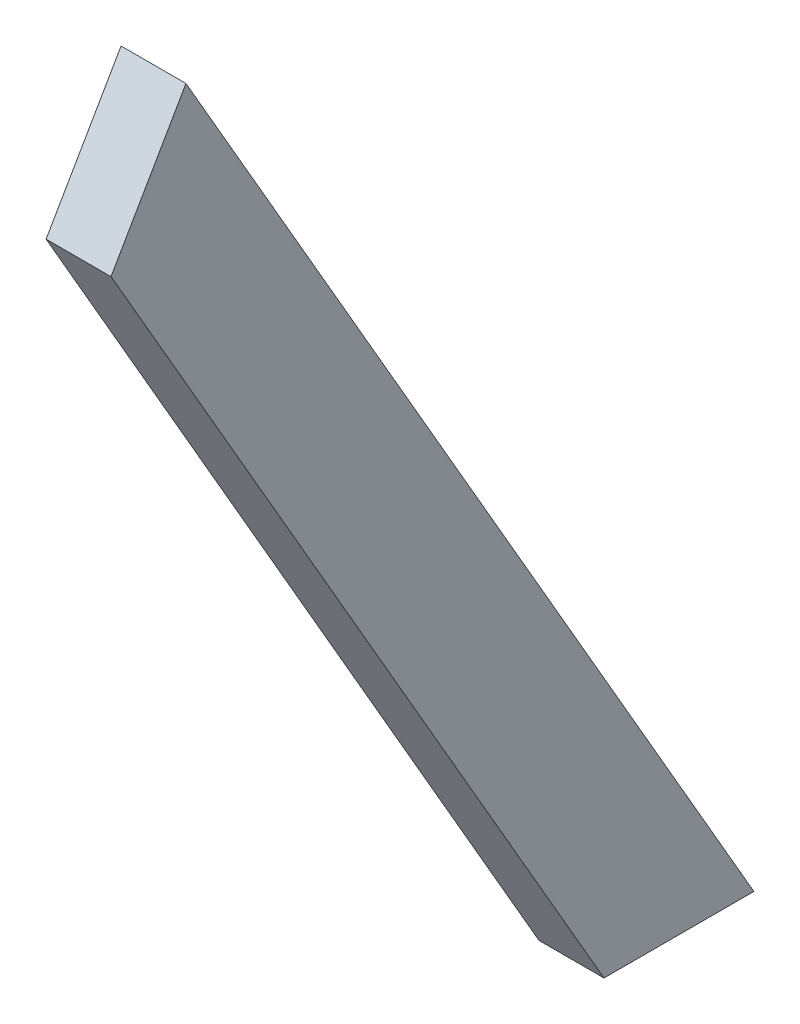
ISO-10303-21;
HEADER;
FILE_DESCRIPTION(('STEP AP214'),'2;1');
FILE_NAME('part.step','',(''),(''),'','','');
FILE_SCHEMA(('AUTOMOTIVE_DESIGN { 1 0 10303 214 1 1 1 1 }'));
ENDSEC;
DATA;
#1=APPLICATION_CONTEXT('core data for automotive mechanical design processes');
#2=APPLICATION_PROTOCOL_DEFINITION('international standard','automotive_design',2000,#1);
#3=PRODUCT_CONTEXT('',#1,'mechanical');
#4=PRODUCT('Part','Part','',(#3));
#5=PRODUCT_RELATED_PRODUCT_CATEGORY('part','',(#4));
#6=PRODUCT_DEFINITION_FORMATION('','',#4);
#7=PRODUCT_DEFINITION_CONTEXT('part definition',#1,'design');
#8=PRODUCT_DEFINITION('design','',#6,#7);
#9=PRODUCT_DEFINITION_SHAPE('','',#8);
#10=(LENGTH_UNIT() NAMED_UNIT(*) SI_UNIT(.MILLI.,.METRE.));
#11=(NAMED_UNIT(*) PLANE_ANGLE_UNIT() SI_UNIT($,.RADIAN.));
#12=(NAMED_UNIT(*) SI_UNIT($,.STERADIAN.) SOLID_ANGLE_UNIT());
#13=UNCERTAINTY_MEASURE_WITH_UNIT(LENGTH_MEASURE(1.E-05),#10,'distance_accuracy_value','');
#14=(GEOMETRIC_REPRESENTATION_CONTEXT(3) GLOBAL_UNCERTAINTY_ASSIGNED_CONTEXT((#13)) GLOBAL_UNIT_ASSIGNED_CONTEXT((#10,
#11,#12)) REPRESENTATION_CONTEXT('',''));
#15=CARTESIAN_POINT('',(0.,0.,0.));
#16=DIRECTION('',(0.,0.,1.));
#17=DIRECTION('',(1.,0.,0.));
#18=AXIS2_PLACEMENT_3D('',#15,#16,#17);
#19=CARTESIAN_POINT('',(25.4,0.,-58.6587873496659));
#20=DIRECTION('',(0.,1.,0.));
#21=DIRECTION('',(0.,0.,1.));
#22=AXIS2_PLACEMENT_3D('',#19,#20,#21);
#23=PLANE('',#22);
#24=DIRECTION('',(0.,0.,-1.));
#25=VECTOR('',#24,1.);
#26=CARTESIAN_POINT('',(0.,0.,-58.6587873496659));
#27=LINE('',#26,#25);
#28=CARTESIAN_POINT('',(0.,0.,0.));
#29=VERTEX_POINT('',#28);
#30=CARTESIAN_POINT('',(0.,0.,-58.6587873496659));
#31=VERTEX_POINT('',#30);
#32=EDGE_CURVE('E96',#29,#31,#27,.T.);
#33=ORIENTED_EDGE('',*,*,#32,.T.);
#34=DIRECTION('',(-1.,0.,0.));
#35=VECTOR('',#34,1.);
#36=CARTESIAN_POINT('',(25.4,0.,-58.6587873496659));
#37=LINE('',#36,#35);
#38=CARTESIAN_POINT('',(25.4,0.,-58.6587873496659));
#39=VERTEX_POINT('',#38);
#40=EDGE_CURVE('E11',#39,#31,#37,.T.);
#41=ORIENTED_EDGE('',*,*,#40,.F.);
#42=DIRECTION('',(0.,0.,-1.));
#43=VECTOR('',#42,1.);
#44=CARTESIAN_POINT('',(25.4,0.,-58.6587873496659));
#45=LINE('',#44,#43);
#46=CARTESIAN_POINT('',(25.4,0.,0.));
#47=VERTEX_POINT('',#46);
#48=EDGE_CURVE('E84',#47,#39,#45,.T.);
#49=ORIENTED_EDGE('',*,*,#48,.F.);
#50=DIRECTION('',(-1.,0.,0.));
#51=VECTOR('',#50,1.);
#52=CARTESIAN_POINT('',(25.4,0.,0.));
#53=LINE('',#52,#51);
#54=EDGE_CURVE('E92',#47,#29,#53,.T.);
#55=ORIENTED_EDGE('',*,*,#54,.T.);
#56=EDGE_LOOP('',(#33,#41,#49,#55));
#57=FACE_BOUND('',#56,.T.);
#58=ADVANCED_FACE('F33',(#57),#23,.F.);
#59=CARTESIAN_POINT('',(25.4,384.948291982183,163.591212650333));
#60=DIRECTION('',(0.,-0.499999999999998,0.86602540378444));
#61=DIRECTION('',(0.,-0.86602540378444,-0.499999999999998));
#62=AXIS2_PLACEMENT_3D('',#59,#60,#61);
#63=PLANE('',#62);
#64=DIRECTION('',(0.,0.86602540378444,0.499999999999998));
#65=VECTOR('',#64,1.);
#66=CARTESIAN_POINT('',(0.,384.948291982183,163.591212650333));
#67=LINE('',#66,#65);
#68=CARTESIAN_POINT('',(0.,384.948291982183,163.591212650333));
#69=VERTEX_POINT('',#68);
#70=EDGE_CURVE('E88',#31,#69,#67,.T.);
#71=ORIENTED_EDGE('',*,*,#70,.T.);
#72=DIRECTION('',(-1.,0.,0.));
#73=VECTOR('',#72,1.);
#74=CARTESIAN_POINT('',(25.4,384.948291982183,163.591212650333));
#75=LINE('',#74,#73);
#76=CARTESIAN_POINT('',(25.4,384.948291982183,163.591212650333));
#77=VERTEX_POINT('',#76);
#78=EDGE_CURVE('E41',#77,#69,#75,.T.);
#79=ORIENTED_EDGE('',*,*,#78,.F.);
#80=DIRECTION('',(0.,0.86602540378444,0.499999999999998));
#81=VECTOR('',#80,1.);
#82=CARTESIAN_POINT('',(25.4,384.948291982183,163.591212650333));
#83=LINE('',#82,#81);
#84=EDGE_CURVE('E79',#39,#77,#83,.T.);
#85=ORIENTED_EDGE('',*,*,#84,.F.);
#86=ORIENTED_EDGE('',*,*,#40,.T.);
#87=EDGE_LOOP('',(#71,#79,#85,#86));
#88=FACE_BOUND('',#87,.T.);
#89=ADVANCED_FACE('F87',(#88),#63,.F.);
#90=CARTESIAN_POINT('',(25.4,334.148291982183,192.920606325166));
#91=DIRECTION('',(0.,-0.499999999999998,-0.866025403784439));
#92=DIRECTION('',(0.,0.86602540378444,-0.499999999999998));
#93=AXIS2_PLACEMENT_3D('',#90,#91,#92);
#94=PLANE('',#93);
#95=DIRECTION('',(0.,-0.86602540378444,0.499999999999998));
#96=VECTOR('',#95,1.);
#97=CARTESIAN_POINT('',(0.,334.148291982183,192.920606325166));
#98=LINE('',#97,#96);
#99=CARTESIAN_POINT('',(0.,334.148291982183,192.920606325166));
#100=VERTEX_POINT('',#99);
#101=EDGE_CURVE('E66',#69,#100,#98,.T.);
#102=ORIENTED_EDGE('',*,*,#101,.T.);
#103=DIRECTION('',(-1.,0.,0.));
#104=VECTOR('',#103,1.);
#105=CARTESIAN_POINT('',(25.4,334.148291982183,192.920606325166));
#106=LINE('',#105,#104);
#107=CARTESIAN_POINT('',(25.4,334.148291982183,192.920606325166));
#108=VERTEX_POINT('',#107);
#109=EDGE_CURVE('E89',#108,#100,#106,.T.);
#110=ORIENTED_EDGE('',*,*,#109,.F.);
#111=DIRECTION('',(0.,-0.86602540378444,0.499999999999998));
#112=VECTOR('',#111,1.);
#113=CARTESIAN_POINT('',(25.4,334.148291982183,192.920606325166));
#114=LINE('',#113,#112);
#115=EDGE_CURVE('E82',#77,#108,#114,.T.);
#116=ORIENTED_EDGE('',*,*,#115,.F.);
#117=ORIENTED_EDGE('',*,*,#78,.T.);
#118=EDGE_LOOP('',(#102,#110,#116,#117));
#119=FACE_BOUND('',#118,.T.);
#120=ADVANCED_FACE('F90',(#119),#94,.F.);
#121=CARTESIAN_POINT('',(25.4,0.,0.));
#122=DIRECTION('',(0.,0.499999999999998,-0.86602540378444));
#123=DIRECTION('',(0.,0.86602540378444,0.499999999999998));
#124=AXIS2_PLACEMENT_3D('',#121,#122,#123);
#125=PLANE('',#124);
#126=DIRECTION('',(0.,-0.86602540378444,-0.499999999999998));
#127=VECTOR('',#126,1.);
#128=CARTESIAN_POINT('',(0.,0.,0.));
#129=LINE('',#128,#127);
#130=EDGE_CURVE('E72',#100,#29,#129,.T.);
#131=ORIENTED_EDGE('',*,*,#130,.T.);
#132=ORIENTED_EDGE('',*,*,#54,.F.);
#133=DIRECTION('',(0.,-0.86602540378444,-0.499999999999998));
#134=VECTOR('',#133,1.);
#135=CARTESIAN_POINT('',(25.4,0.,0.));
#136=LINE('',#135,#134);
#137=EDGE_CURVE('E49',#108,#47,#136,.T.);
#138=ORIENTED_EDGE('',*,*,#137,.F.);
#139=ORIENTED_EDGE('',*,*,#109,.T.);
#140=EDGE_LOOP('',(#131,#132,#138,#139));
#141=FACE_BOUND('',#140,.T.);
#142=ADVANCED_FACE('F103',(#141),#125,.F.);
#143=CARTESIAN_POINT('',(25.4,0.,0.));
#144=DIRECTION('',(-1.,0.,0.));
#145=DIRECTION('',(0.,0.,1.));
#146=AXIS2_PLACEMENT_3D('',#143,#144,#145);
#147=PLANE('',#146);
#148=ORIENTED_EDGE('',*,*,#48,.T.);
#149=ORIENTED_EDGE('',*,*,#84,.T.);
#150=ORIENTED_EDGE('',*,*,#115,.T.);
#151=ORIENTED_EDGE('',*,*,#137,.T.);
#152=EDGE_LOOP('',(#148,#149,#150,#151));
#153=FACE_BOUND('',#152,.T.);
#154=ADVANCED_FACE('F80',(#153),#147,.F.);
#155=CARTESIAN_POINT('',(0.,0.,0.));
#156=DIRECTION('',(-1.,0.,0.));
#157=DIRECTION('',(0.,0.,1.));
#158=AXIS2_PLACEMENT_3D('',#155,#156,#157);
#159=PLANE('',#158);
#160=ORIENTED_EDGE('',*,*,#32,.F.);
#161=ORIENTED_EDGE('',*,*,#130,.F.);
#162=ORIENTED_EDGE('',*,*,#101,.F.);
#163=ORIENTED_EDGE('',*,*,#70,.F.);
#164=EDGE_LOOP('',(#160,#161,#162,#163));
#165=FACE_BOUND('',#164,.T.);
#166=ADVANCED_FACE('F106',(#165),#159,.T.);
#167=CLOSED_SHELL('',(#58,#89,#120,#142,#154,#166));
#168=MANIFOLD_SOLID_BREP('B2',#167);
#169=ADVANCED_BREP_SHAPE_REPRESENTATION('',(#18,#168),#14);
#170=SHAPE_DEFINITION_REPRESENTATION(#9,#169);
ENDSEC;
END-ISO-10303-21;
